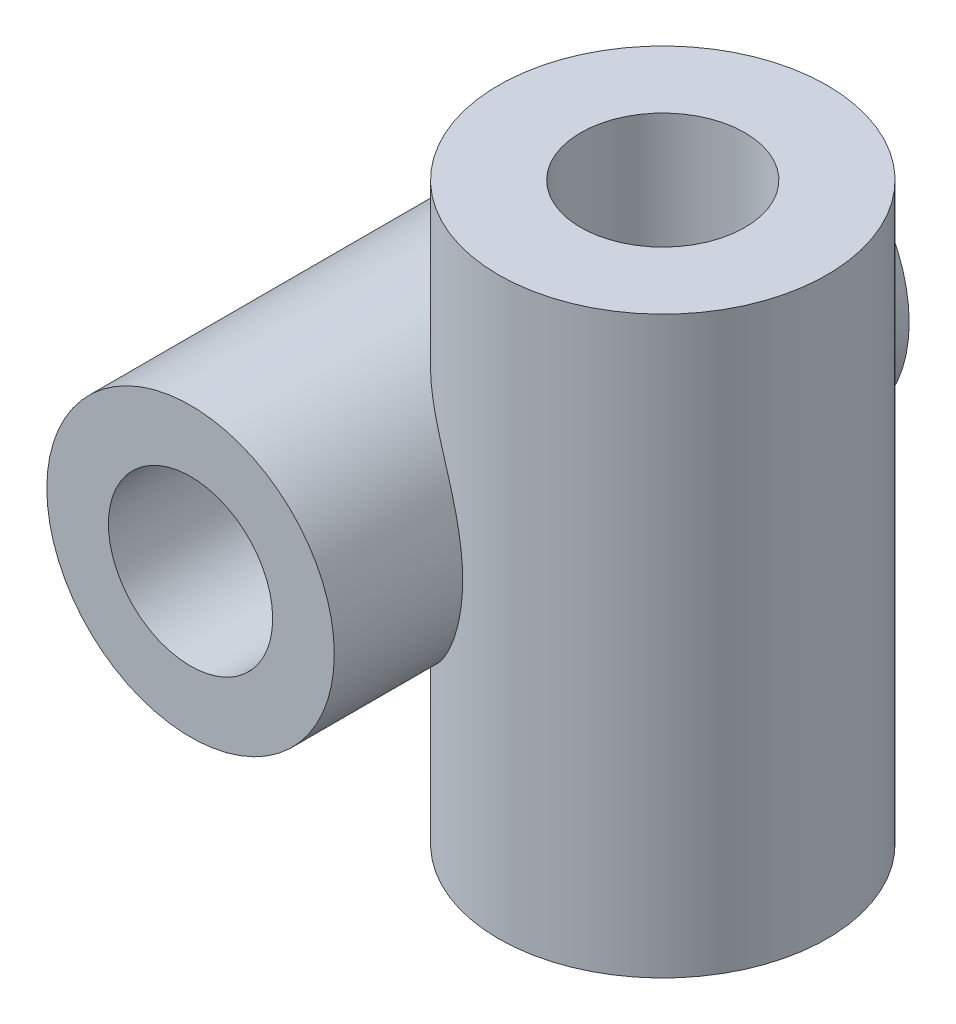
ISO-10303-21;
HEADER;
FILE_DESCRIPTION(('STEP AP214'),'2;1');
FILE_NAME('part.step','',(''),(''),'','','');
FILE_SCHEMA(('AUTOMOTIVE_DESIGN { 1 0 10303 214 1 1 1 1 }'));
ENDSEC;
DATA;
#1=APPLICATION_CONTEXT('core data for automotive mechanical design processes');
#2=APPLICATION_PROTOCOL_DEFINITION('international standard','automotive_design',2000,#1);
#3=PRODUCT_CONTEXT('',#1,'mechanical');
#4=PRODUCT('Part','Part','',(#3));
#5=PRODUCT_RELATED_PRODUCT_CATEGORY('part','',(#4));
#6=PRODUCT_DEFINITION_FORMATION('','',#4);
#7=PRODUCT_DEFINITION_CONTEXT('part definition',#1,'design');
#8=PRODUCT_DEFINITION('design','',#6,#7);
#9=PRODUCT_DEFINITION_SHAPE('','',#8);
#10=(LENGTH_UNIT() NAMED_UNIT(*) SI_UNIT(.MILLI.,.METRE.));
#11=(NAMED_UNIT(*) PLANE_ANGLE_UNIT() SI_UNIT($,.RADIAN.));
#12=(NAMED_UNIT(*) SI_UNIT($,.STERADIAN.) SOLID_ANGLE_UNIT());
#13=UNCERTAINTY_MEASURE_WITH_UNIT(LENGTH_MEASURE(1.E-05),#10,'distance_accuracy_value','');
#14=(GEOMETRIC_REPRESENTATION_CONTEXT(3) GLOBAL_UNCERTAINTY_ASSIGNED_CONTEXT((#13)) GLOBAL_UNIT_ASSIGNED_CONTEXT((#10,
#11,#12)) REPRESENTATION_CONTEXT('',''));
#15=CARTESIAN_POINT('',(0.,0.,0.));
#16=DIRECTION('',(0.,0.,1.));
#17=DIRECTION('',(1.,0.,0.));
#18=AXIS2_PLACEMENT_3D('',#15,#16,#17);
#19=CARTESIAN_POINT('',(-1.04410566392106E-13,0.,28.));
#20=DIRECTION('',(0.,0.,1.));
#21=DIRECTION('',(1.,0.,0.));
#22=AXIS2_PLACEMENT_3D('',#19,#20,#21);
#23=PLANE('',#22);
#24=CARTESIAN_POINT('',(-1.04410566392106E-13,0.,28.));
#25=DIRECTION('',(0.,0.,1.));
#26=DIRECTION('',(1.,0.,0.));
#27=AXIS2_PLACEMENT_3D('',#24,#25,#26);
#28=CIRCLE('',#27,14.);
#29=CARTESIAN_POINT('',(13.9999999999999,0.,28.));
#30=VERTEX_POINT('',#29);
#31=EDGE_CURVE('E10',#30,#30,#28,.T.);
#32=ORIENTED_EDGE('',*,*,#31,.T.);
#33=EDGE_LOOP('',(#32));
#34=FACE_BOUND('',#33,.T.);
#35=CARTESIAN_POINT('',(-1.04410566392106E-13,0.,28.));
#36=DIRECTION('',(0.,0.,1.));
#37=DIRECTION('',(1.,0.,0.));
#38=AXIS2_PLACEMENT_3D('',#35,#36,#37);
#39=CIRCLE('',#38,8.);
#40=CARTESIAN_POINT('',(7.9999999999999,0.,28.));
#41=VERTEX_POINT('',#40);
#42=EDGE_CURVE('E43',#41,#41,#39,.T.);
#43=ORIENTED_EDGE('',*,*,#42,.F.);
#44=EDGE_LOOP('',(#43));
#45=FACE_BOUND('',#44,.T.);
#46=ADVANCED_FACE('F31',(#34,#45),#23,.T.);
#47=CARTESIAN_POINT('',(-1.04410566392106E-13,0.,-28.));
#48=DIRECTION('',(0.,0.,1.));
#49=DIRECTION('',(1.,0.,0.));
#50=AXIS2_PLACEMENT_3D('',#47,#48,#49);
#51=PLANE('',#50);
#52=CARTESIAN_POINT('',(-1.04410566392106E-13,0.,-28.));
#53=DIRECTION('',(0.,0.,1.));
#54=DIRECTION('',(1.,0.,0.));
#55=AXIS2_PLACEMENT_3D('',#52,#53,#54);
#56=CIRCLE('',#55,14.);
#57=CARTESIAN_POINT('',(13.9999999999999,0.,-28.));
#58=VERTEX_POINT('',#57);
#59=EDGE_CURVE('E36',#58,#58,#56,.T.);
#60=ORIENTED_EDGE('',*,*,#59,.F.);
#61=EDGE_LOOP('',(#60));
#62=FACE_BOUND('',#61,.T.);
#63=CARTESIAN_POINT('',(-1.04410566392106E-13,0.,-28.));
#64=DIRECTION('',(0.,0.,1.));
#65=DIRECTION('',(1.,0.,0.));
#66=AXIS2_PLACEMENT_3D('',#63,#64,#65);
#67=CIRCLE('',#66,8.);
#68=CARTESIAN_POINT('',(7.9999999999999,0.,-28.));
#69=VERTEX_POINT('',#68);
#70=EDGE_CURVE('E45',#69,#69,#67,.T.);
#71=ORIENTED_EDGE('',*,*,#70,.T.);
#72=EDGE_LOOP('',(#71));
#73=FACE_BOUND('',#72,.T.);
#74=ADVANCED_FACE('F80',(#62,#73),#51,.F.);
#75=CARTESIAN_POINT('',(-1.04410566392106E-13,0.,28.));
#76=DIRECTION('',(0.,0.,-1.));
#77=DIRECTION('',(-1.,0.,0.));
#78=AXIS2_PLACEMENT_3D('',#75,#76,#77);
#79=CYLINDRICAL_SURFACE('',#78,14.);
#80=CARTESIAN_POINT('',(13.9999999999999,0.,15.4919333848297));
#81=CARTESIAN_POINT('',(14.0000010223322,0.3719893981309,15.4919319379812));
#82=CARTESIAN_POINT('',(13.9851652845214,0.743958537766238,15.4881253331868));
#83=CARTESIAN_POINT('',(13.9259351607412,1.48549698696584,15.472651530554));
#84=CARTESIAN_POINT('',(13.8815319344084,1.85506554540225,15.460981981767));
#85=CARTESIAN_POINT('',(13.7634391873865,2.5896585127759,15.4290405567903));
#86=CARTESIAN_POINT('',(13.6897082688819,2.95467574284538,15.4087565179741));
#87=CARTESIAN_POINT('',(13.5136095997293,3.6770281816098,15.3584075287863));
#88=CARTESIAN_POINT('',(13.4112440435745,4.03436397673338,15.3283433279151));
#89=CARTESIAN_POINT('',(13.1786364873007,4.73936121340051,15.2567780808745));
#90=CARTESIAN_POINT('',(13.0483474806903,5.08700521050069,15.2152577150333));
#91=CARTESIAN_POINT('',(12.7613446319282,5.76931981462684,15.1188423237718));
#92=CARTESIAN_POINT('',(12.6046301235389,6.10399009429874,15.0639469611267));
#93=CARTESIAN_POINT('',(12.2667269400419,6.75740943711765,14.9386080373643));
#94=CARTESIAN_POINT('',(12.0855560189625,7.07616982216665,14.8681757319197));
#95=CARTESIAN_POINT('',(11.7010463612786,7.69534151583395,14.709398857686));
#96=CARTESIAN_POINT('',(11.4977090511808,7.99575400328273,14.621055441243));
#97=CARTESIAN_POINT('',(11.0808218140822,8.56353855489522,14.428286468058));
#98=CARTESIAN_POINT('',(10.8680562724714,8.83176745995553,14.3246894149803));
#99=CARTESIAN_POINT('',(10.4282124858044,9.34703714807949,14.0971382459776));
#100=CARTESIAN_POINT('',(10.2011347115589,9.59407862748742,13.9731847994748));
#101=CARTESIAN_POINT('',(9.73659856178757,10.0651887025144,13.7035850204633));
#102=CARTESIAN_POINT('',(9.49914675873699,10.289271550966,13.5579522860225));
#103=CARTESIAN_POINT('',(9.01793873546161,10.7135269485602,13.2440569747968));
#104=CARTESIAN_POINT('',(8.77418293542418,10.9137010863456,13.0757959031601));
#105=CARTESIAN_POINT('',(8.30509106729305,11.2741118813541,12.7313108204222));
#106=CARTESIAN_POINT('',(8.07990295716784,11.4362836045115,12.5569029111898));
#107=CARTESIAN_POINT('',(7.63135125797163,11.7403531444371,12.1891431261527));
#108=CARTESIAN_POINT('',(7.40798755672186,11.8822522167085,11.9957924247432));
#109=CARTESIAN_POINT('',(6.96626871744345,12.1464963270059,11.5907971614857));
#110=CARTESIAN_POINT('',(6.7479145896599,12.268837450096,11.3791489500366));
#111=CARTESIAN_POINT('',(6.31919476081952,12.4950607332025,10.938613627307));
#112=CARTESIAN_POINT('',(6.1088293939007,12.5989421217889,10.7097257961538));
#113=CARTESIAN_POINT('',(5.69477093902298,12.7915095924464,10.2314842600988));
#114=CARTESIAN_POINT('',(5.49128033511558,12.8798697642549,9.98182451767351));
#115=CARTESIAN_POINT('',(5.09756354532838,13.0407086490837,9.46742083189415));
#116=CARTESIAN_POINT('',(4.90733740691156,13.1131873052785,9.2026768345717));
#117=CARTESIAN_POINT('',(4.54195041100528,13.2441828167058,8.65956498000809));
#118=CARTESIAN_POINT('',(4.36679492854313,13.3026947037104,8.38119231711594));
#119=CARTESIAN_POINT('',(4.0331087629745,13.407633223415,7.81246952220624));
#120=CARTESIAN_POINT('',(3.8745791596488,13.4540590714675,7.52211861395635));
#121=CARTESIAN_POINT('',(3.55457786400708,13.5423869176069,6.88999548082267));
#122=CARTESIAN_POINT('',(3.39574339650246,13.5827702194482,6.54667364342047));
#123=CARTESIAN_POINT('',(3.10248068202797,13.6527412284995,5.84869716529793));
#124=CARTESIAN_POINT('',(2.96805424481148,13.6823281353662,5.49404168652635));
#125=CARTESIAN_POINT('',(2.72453722881706,13.7328939580388,4.77537837736546));
#126=CARTESIAN_POINT('',(2.61545736400202,13.7538692365831,4.41136666405002));
#127=CARTESIAN_POINT('',(2.42341677314304,13.7890018452293,3.67619695590906));
#128=CARTESIAN_POINT('',(2.34045719874774,13.8031588747277,3.30503864675414));
#129=CARTESIAN_POINT('',(2.19237137366985,13.8275044610656,2.51040764440345));
#130=CARTESIAN_POINT('',(2.13081589920177,13.8369669278539,2.08624299719925));
#131=CARTESIAN_POINT('',(2.04192538833772,13.8503628485877,1.23423932546827));
#132=CARTESIAN_POINT('',(2.01459305607975,13.8542958656274,0.806400013277153));
#133=CARTESIAN_POINT('',(1.99434217028345,13.8572258961627,-0.0502421860832204));
#134=CARTESIAN_POINT('',(2.00143400896337,13.8562214190908,-0.479045325165186));
#135=CARTESIAN_POINT('',(2.05000595660913,13.8491180338994,-1.33465578765831));
#136=CARTESIAN_POINT('',(2.09148621039783,13.8430191043253,-1.76146310265668));
#137=CARTESIAN_POINT('',(2.21073321043063,13.824487363549,-2.62612862836137));
#138=CARTESIAN_POINT('',(2.28979810974131,13.8118263627565,-3.06380373303443));
#139=CARTESIAN_POINT('',(2.48399867564151,13.7782237323857,-3.93078223037483));
#140=CARTESIAN_POINT('',(2.59913596085037,13.757281731216,-4.36008524645623));
#141=CARTESIAN_POINT('',(2.86454074947749,13.7044778045725,-5.20720067808821));
#142=CARTESIAN_POINT('',(3.01482128003288,13.6726118276792,-5.62500876827648));
#143=CARTESIAN_POINT('',(3.34903795154691,13.5946083402935,-6.44558195288962));
#144=CARTESIAN_POINT('',(3.5329727179728,13.5484714126133,-6.84834766087862));
#145=CARTESIAN_POINT('',(3.92765925962188,13.439285003986,-7.62592554742595));
#146=CARTESIAN_POINT('',(4.13766550852467,13.3766658369723,-8.00117563769634));
#147=CARTESIAN_POINT('',(4.58510671433127,13.2299732735159,-8.73061580235941));
#148=CARTESIAN_POINT('',(4.82254184791418,13.1458997388738,-9.08480574107398));
#149=CARTESIAN_POINT('',(5.32079408466342,12.952236908248,-9.76812304514505));
#150=CARTESIAN_POINT('',(5.58157414114876,12.8426876139583,-10.0972886391936));
#151=CARTESIAN_POINT('',(6.12200605958196,12.5940222859687,-10.7277920326739));
#152=CARTESIAN_POINT('',(6.40165379744517,12.4549126993394,-11.0291358794769));
#153=CARTESIAN_POINT('',(6.93650706071177,12.1640893868423,-11.563867119753));
#154=CARTESIAN_POINT('',(7.19015463672293,12.0163746344405,-11.8009941100826));
#155=CARTESIAN_POINT('',(7.70250774587176,11.6945639210744,-12.2506232724897));
#156=CARTESIAN_POINT('',(7.96121280746002,11.5204704094892,-12.4631277276439));
#157=CARTESIAN_POINT('',(8.47846199534632,11.1452987684384,-12.8626235576442));
#158=CARTESIAN_POINT('',(8.73700613174953,10.9442355662721,-13.0496289311877));
#159=CARTESIAN_POINT('',(9.2488464585048,10.5152403507644,-13.3982536522082));
#160=CARTESIAN_POINT('',(9.50214308510588,10.2873105815858,-13.5598751173748));
#161=CARTESIAN_POINT('',(9.96601038048726,9.83712775699864,-13.8390200923727));
#162=CARTESIAN_POINT('',(10.1778413221085,9.61801963903996,-13.9595460744803));
#163=CARTESIAN_POINT('',(10.5906821332115,9.1614487637564,-14.1829861902651));
#164=CARTESIAN_POINT('',(10.7916931540159,8.92398796587345,-14.2859022003279));
#165=CARTESIAN_POINT('',(11.1802601810072,8.4320849382857,-14.475424382061));
#166=CARTESIAN_POINT('',(11.3678132665817,8.17763904549972,-14.5620270200255));
#167=CARTESIAN_POINT('',(11.7271381961147,7.65344483833426,-14.7203861704857));
#168=CARTESIAN_POINT('',(11.898909218597,7.38369572858383,-14.7921419104249));
#169=CARTESIAN_POINT('',(12.228254807454,6.82475257956943,-14.9237760579557));
#170=CARTESIAN_POINT('',(12.3854472201623,6.53526606857633,-14.9833676477364));
#171=CARTESIAN_POINT('',(12.6797667253518,5.9441189269146,-15.0903825997153));
#172=CARTESIAN_POINT('',(12.8168937888481,5.64245827866096,-15.1378059443363));
#173=CARTESIAN_POINT('',(13.069850171734,5.02883438560741,-15.22206975182));
#174=CARTESIAN_POINT('',(13.1856747834149,4.71686888142395,-15.2589078764242));
#175=CARTESIAN_POINT('',(13.3950296681057,4.08461683763342,-15.3233888223324));
#176=CARTESIAN_POINT('',(13.4885588455723,3.76432988998815,-15.3510311918057));
#177=CARTESIAN_POINT('',(13.6596577931562,3.08951236016707,-15.4003263345912));
#178=CARTESIAN_POINT('',(13.735164792468,2.7344047055071,-15.4212600558785));
#179=CARTESIAN_POINT('',(13.8584042229182,2.01900975098615,-15.4548134979711));
#180=CARTESIAN_POINT('',(13.9061352323254,1.65872218695536,-15.4674327932017));
#181=CARTESIAN_POINT('',(13.9734515509374,0.935240188415863,-15.4850935867121));
#182=CARTESIAN_POINT('',(13.9930289275377,0.572044963615724,-15.4901329492786));
#183=CARTESIAN_POINT('',(14.0038620300949,-0.154795989163676,-15.4929309027017));
#184=CARTESIAN_POINT('',(13.9951173361474,-0.518441723742316,-15.4906893856117));
#185=CARTESIAN_POINT('',(13.9483594605568,-1.25986103096941,-15.4785281757133));
#186=CARTESIAN_POINT('',(13.9090710406459,-1.63754947080463,-15.4682738396915));
#187=CARTESIAN_POINT('',(13.8000168950498,-2.38817354155169,-15.4390194281233));
#188=CARTESIAN_POINT('',(13.7302500103201,-2.76110899116023,-15.4200190199771));
#189=CARTESIAN_POINT('',(13.5608466758028,-3.49956522916187,-15.3721066467605));
#190=CARTESIAN_POINT('',(13.4612048941198,-3.8650846815482,-15.3431929122857));
#191=CARTESIAN_POINT('',(13.2330147353205,-4.58587019798531,-15.2738358739624));
#192=CARTESIAN_POINT('',(13.1044669750903,-4.94113648066776,-15.2333928161578));
#193=CARTESIAN_POINT('',(12.8210489946112,-5.63561313287337,-15.1393708621623));
#194=CARTESIAN_POINT('',(12.6664145796669,-5.97493528152639,-15.0859078888758));
#195=CARTESIAN_POINT('',(12.3318709845809,-6.63798344683747,-14.9634228770433));
#196=CARTESIAN_POINT('',(12.1519617272526,-6.9617094158624,-14.8944007909811));
#197=CARTESIAN_POINT('',(11.7693866538876,-7.59057877943662,-14.7384555534411));
#198=CARTESIAN_POINT('',(11.5667375747351,-7.89573558934801,-14.6515455289851));
#199=CARTESIAN_POINT('',(11.1416155263069,-8.48506718238525,-14.4574242699417));
#200=CARTESIAN_POINT('',(10.9191443759557,-8.76924388633266,-14.3502148970611));
#201=CARTESIAN_POINT('',(10.4741444971619,-9.2953015340768,-14.1216013070429));
#202=CARTESIAN_POINT('',(10.252694140213,-9.53874936868367,-14.0017012716596));
#203=CARTESIAN_POINT('',(9.7993915277861,-10.0038671492477,-13.7411181322249));
#204=CARTESIAN_POINT('',(9.56753984372,-10.2255382894099,-13.6004361688873));
#205=CARTESIAN_POINT('',(9.09746058203268,-10.6459197121628,-13.297478058772));
#206=CARTESIAN_POINT('',(8.85923601239756,-10.8446405996745,-13.1352119608457));
#207=CARTESIAN_POINT('',(8.38045367358236,-11.2187476157424,-12.7887298100641));
#208=CARTESIAN_POINT('',(8.13989599056826,-11.3941346025662,-12.6045145650152));
#209=CARTESIAN_POINT('',(7.67780420750712,-11.7099946142202,-12.2284325388142));
#210=CARTESIAN_POINT('',(7.45614296407507,-11.8520694302155,-12.0380617706204));
#211=CARTESIAN_POINT('',(7.01756245336114,-12.1169074251783,-11.6393249421734));
#212=CARTESIAN_POINT('',(6.80064292372984,-12.2396716749007,-11.4309598806819));
#213=CARTESIAN_POINT('',(6.37437257996178,-12.4669866684238,-10.9971493297208));
#214=CARTESIAN_POINT('',(6.16502385236452,-12.5715324210061,-10.771699183745));
#215=CARTESIAN_POINT('',(5.75648521731966,-12.7637714356506,-10.3049768948195));
#216=CARTESIAN_POINT('',(5.557295858607,-12.8514637881218,-10.0637038988406));
#217=CARTESIAN_POINT('',(5.16113675281877,-13.0157997570397,-9.55370215806306));
#218=CARTESIAN_POINT('',(4.9648277352158,-13.0916258332646,-9.28419744817913));
#219=CARTESIAN_POINT('',(4.58790488952025,-13.2284292466052,-8.73085315909167));
#220=CARTESIAN_POINT('',(4.40729143554609,-13.2894062298415,-8.44701323844985));
#221=CARTESIAN_POINT('',(4.06332149864369,-13.3985820145389,-7.86656539416624));
#222=CARTESIAN_POINT('',(3.89997187973651,-13.4467757448497,-7.56995245750926));
#223=CARTESIAN_POINT('',(3.59188019224728,-13.5323301063804,-6.96571064116608));
#224=CARTESIAN_POINT('',(3.44713929678048,-13.5696900548125,-6.65808106854004));
#225=CARTESIAN_POINT('',(3.1571400169486,-13.6403068722276,-5.9868454904395));
#226=CARTESIAN_POINT('',(3.01501851429771,-13.6721227414502,-5.62172917900673));
#227=CARTESIAN_POINT('',(2.75777785237119,-13.726322873475,-4.88142084924792));
#228=CARTESIAN_POINT('',(2.64266088706079,-13.748706370068,-4.50622801501959));
#229=CARTESIAN_POINT('',(2.44020610887152,-13.7860800501147,-3.7479156010252));
#230=CARTESIAN_POINT('',(2.35287856594805,-13.8010675013844,-3.36479314634066));
#231=CARTESIAN_POINT('',(2.20662418311687,-13.8252050427123,-2.59298602174278));
#232=CARTESIAN_POINT('',(2.14769832996876,-13.8343549299595,-2.20430115905779));
#233=CARTESIAN_POINT('',(2.05385715820689,-13.8486175317774,-1.38187764664942));
#234=CARTESIAN_POINT('',(2.02217503515958,-13.8531952429008,-0.947757314009264));
#235=CARTESIAN_POINT('',(1.9942802470715,-13.8572375752184,-0.0783359031601875));
#236=CARTESIAN_POINT('',(1.99807014905972,-13.8567018263632,0.356965258223676));
#237=CARTESIAN_POINT('',(2.04110380458551,-13.8504285514721,1.22594296822046));
#238=CARTESIAN_POINT('',(2.08036083796351,-13.8446890770197,1.65961884720498));
#239=CARTESIAN_POINT('',(2.19406100420439,-13.8271254264709,2.5222097661283));
#240=CARTESIAN_POINT('',(2.2685040611454,-13.8153012635035,2.95112481633762));
#241=CARTESIAN_POINT('',(2.45403696554343,-13.7835684725784,3.81057993117113));
#242=CARTESIAN_POINT('',(2.565898038334,-13.7634874766331,4.24094762032226));
#243=CARTESIAN_POINT('',(2.82483972014217,-13.712683042927,5.09034730744066));
#244=CARTESIAN_POINT('',(2.97192169500787,-13.6819591924213,5.50937886509714));
#245=CARTESIAN_POINT('',(3.29991297239227,-13.6065748448491,6.33275717344604));
#246=CARTESIAN_POINT('',(3.48082451036022,-13.5619134266611,6.73710295159588));
#247=CARTESIAN_POINT('',(3.87446460808367,-13.4547429542298,7.52755752530308));
#248=CARTESIAN_POINT('',(4.08719093946973,-13.3922351497033,7.91366759563433));
#249=CARTESIAN_POINT('',(4.53178458629659,-13.2482110164413,8.64772912953551));
#250=CARTESIAN_POINT('',(4.76242081865325,-13.1676371879503,8.99660937579917));
#251=CARTESIAN_POINT('',(5.24688630540064,-12.9821959073676,9.67111367310789));
#252=CARTESIAN_POINT('',(5.50071516591912,-12.8773288677927,9.99673811893077));
#253=CARTESIAN_POINT('',(6.02669021045121,-12.6397032026824,10.6210239546251));
#254=CARTESIAN_POINT('',(6.29880424298495,-12.5069927059651,10.9197306158785));
#255=CARTESIAN_POINT('',(6.85616340885904,-12.2103458671319,11.4879577311215));
#256=CARTESIAN_POINT('',(7.14140554323645,-12.0464166299909,11.7574848041522));
#257=CARTESIAN_POINT('',(7.67543480204572,-11.7120303126262,12.2274474051982));
#258=CARTESIAN_POINT('',(7.92332539272071,-11.546180332966,12.4321948027418));
#259=CARTESIAN_POINT('',(8.41937860798611,-11.1896070068989,12.8183638843327));
#260=CARTESIAN_POINT('',(8.66754120092175,-10.9988863015299,12.9997880410331));
#261=CARTESIAN_POINT('',(9.15948786884705,-10.5927100857364,13.3392158800285));
#262=CARTESIAN_POINT('',(9.40327280794802,-10.3772595202439,13.4972242300731));
#263=CARTESIAN_POINT('',(9.88202881286162,-9.92242376312254,13.790481025752));
#264=CARTESIAN_POINT('',(10.1170002042083,-9.6830394567012,13.9257303126514));
#265=CARTESIAN_POINT('',(10.5508111256428,-9.20724228858997,14.1620726623845));
#266=CARTESIAN_POINT('',(10.7508987782066,-8.97298820294156,14.2652383525544));
#267=CARTESIAN_POINT('',(11.1379757187451,-8.48774412016533,14.4554186218102));
#268=CARTESIAN_POINT('',(11.3249660761581,-8.23675549274342,14.5424345205404));
#269=CARTESIAN_POINT('',(11.6836807519858,-7.71950256393237,14.7017912820205));
#270=CARTESIAN_POINT('',(11.8553979240501,-7.45323120660028,14.7741252951727));
#271=CARTESIAN_POINT('',(12.1816010643344,-6.90722420517958,14.9056086457293));
#272=CARTESIAN_POINT('',(12.3360862985684,-6.62748798828783,14.964757421622));
#273=CARTESIAN_POINT('',(12.6335680250358,-6.04202736409648,15.0740763748559));
#274=CARTESIAN_POINT('',(12.7756031064182,-5.73570294409802,15.1236493297829));
#275=CARTESIAN_POINT('',(13.0376286744537,-5.11220307648093,15.2116395802049));
#276=CARTESIAN_POINT('',(13.1576172201316,-4.79502667636805,15.2500558936429));
#277=CARTESIAN_POINT('',(13.3743970370869,-4.15216391905494,15.3172018499767));
#278=CARTESIAN_POINT('',(13.471208669746,-3.82648531229574,15.3459400044248));
#279=CARTESIAN_POINT('',(13.6409815207266,-3.16845164723531,15.3950234938114));
#280=CARTESIAN_POINT('',(13.7139480243468,-2.83609808580421,15.4153706888775));
#281=CARTESIAN_POINT('',(13.8495534188615,-2.08929813976195,15.4525048346954));
#282=CARTESIAN_POINT('',(13.9059247627535,-1.67360406718945,15.4673870649412));
#283=CARTESIAN_POINT('',(13.9811482258688,-0.838598179703821,15.4871023559461));
#284=CARTESIAN_POINT('',(13.9999988476826,-0.419286221075626,15.4919350156386));
#285=CARTESIAN_POINT('',(13.9999999999999,0.,15.4919333848297));
#286=B_SPLINE_CURVE_WITH_KNOTS('',3,(#80,#81,#82,#83,#84,#85,#86,#87,#88,#89,#90,#91,#92,#93,
#94,#95,#96,#97,#98,#99,#100,#101,#102,#103,#104,#105,#106,#107,#108,#109,#110,#111,#112,#113,
#114,#115,#116,#117,#118,#119,#120,#121,#122,#123,#124,#125,#126,#127,#128,#129,#130,#131,#132,
#133,#134,#135,#136,#137,#138,#139,#140,#141,#142,#143,#144,#145,#146,#147,#148,#149,#150,#151,
#152,#153,#154,#155,#156,#157,#158,#159,#160,#161,#162,#163,#164,#165,#166,#167,#168,#169,#170,
#171,#172,#173,#174,#175,#176,#177,#178,#179,#180,#181,#182,#183,#184,#185,#186,#187,#188,#189,
#190,#191,#192,#193,#194,#195,#196,#197,#198,#199,#200,#201,#202,#203,#204,#205,#206,#207,#208,
#209,#210,#211,#212,#213,#214,#215,#216,#217,#218,#219,#220,#221,#222,#223,#224,#225,#226,#227,
#228,#229,#230,#231,#232,#233,#234,#235,#236,#237,#238,#239,#240,#241,#242,#243,#244,#245,#246,
#247,#248,#249,#250,#251,#252,#253,#254,#255,#256,#257,#258,#259,#260,#261,#262,#263,#264,#265,
#266,#267,#268,#269,#270,#271,#272,#273,#274,#275,#276,#277,#278,#279,#280,#281,#282,#283,#284,
#285),.UNSPECIFIED.,.T.,.F.,(4,2,2,2,2,2,2,2,2,2,2,2,2,2,2,2,2,2,2,2,2,2,2,2,2,2,2,2,2,2,2,2,2,
2,2,2,2,2,2,2,2,2,2,2,2,2,2,2,2,2,2,2,2,2,2,2,2,2,2,2,2,2,2,2,2,2,2,2,2,2,2,2,2,2,2,2,2,2,2,2,2,
2,2,2,2,2,2,2,2,2,2,2,2,2,2,2,2,2,2,2,2,2,4),(0.,1.1156177769199,2.23156926150023,
3.3491016013208,4.46654831947236,5.5858911400937,6.70526218572042,7.82382495540331,
8.9423157830015,10.013962544214,11.0855740712598,12.1565162533687,13.2273872358127,
14.2094945078149,15.1915409306536,16.1737836853168,17.1560674781307,18.1569991782141,
19.1579344596528,20.1592252627184,21.1605810551831,22.3007162371138,23.4409359208108,
24.5816367006641,25.7223877671948,27.0070710201967,28.2918557759068,29.5770284158699,
30.8622064682175,32.195413743443,33.5286808501475,34.862442966984,36.1961506214143,
37.4980001015192,38.7998579677621,40.0996853142503,41.3992294601077,42.5295803236096,
43.6598262935125,44.7894492516769,45.9189779192759,46.9010181631258,47.8829537029396,
48.8651016998263,49.8473007898215,50.8505045918503,51.8537098430142,52.8571365305713,
53.8606125139069,54.9503410813101,56.0401254222402,57.1302167621129,58.2203242638098,
59.3585630678554,60.4968451609639,61.6353305289921,62.7737916027625,63.9024649135038,
65.0311416711692,66.1589930864862,67.2867411136307,68.336118714633,69.3854387369991,
70.4342719298398,71.4830665338218,72.4566512514841,73.4301819656336,74.4039789745955,
75.3778285253842,76.4026020908613,77.4274000760769,78.4526039954034,79.4778725131013,
80.6559203527328,81.8340638689357,83.0126422796551,84.1912616347609,85.4956527922389,
86.8001383462393,88.1051125369576,89.4100839119094,90.7438047961186,92.0775774097018,
93.4114381898172,94.7452055874695,96.0210987745252,97.296970297562,98.5706543191762,
99.8440488127255,100.927821172623,102.011478539628,103.094919596979,104.178320597254,
105.151894676471,106.12538916719,107.099336787462,108.073325876725,109.096041919891,
110.118847959795,111.140752119374,112.162429618911,113.419843129672,114.677306821379),.UNSPECIFIED.);
#287=CARTESIAN_POINT('',(13.9999999999999,0.,15.4919333848297));
#288=VERTEX_POINT('',#287);
#289=EDGE_CURVE('E48',#288,#288,#286,.T.);
#290=ORIENTED_EDGE('',*,*,#289,.T.);
#291=EDGE_LOOP('',(#290));
#292=FACE_BOUND('',#291,.T.);
#293=ORIENTED_EDGE('',*,*,#31,.F.);
#294=EDGE_LOOP('',(#293));
#295=FACE_BOUND('',#294,.T.);
#296=ORIENTED_EDGE('',*,*,#59,.T.);
#297=EDGE_LOOP('',(#296));
#298=FACE_BOUND('',#297,.T.);
#299=ADVANCED_FACE('F33',(#292,#295,#298),#79,.T.);
#300=CARTESIAN_POINT('',(-1.04410566392106E-13,0.,28.));
#301=DIRECTION('',(0.,0.,-1.));
#302=DIRECTION('',(-1.,0.,0.));
#303=AXIS2_PLACEMENT_3D('',#300,#301,#302);
#304=CYLINDRICAL_SURFACE('',#303,8.);
#305=ORIENTED_EDGE('',*,*,#42,.T.);
#306=EDGE_LOOP('',(#305));
#307=FACE_BOUND('',#306,.T.);
#308=ORIENTED_EDGE('',*,*,#70,.F.);
#309=EDGE_LOOP('',(#308));
#310=FACE_BOUND('',#309,.T.);
#311=ADVANCED_FACE('F71',(#307,#310),#304,.F.);
#312=CARTESIAN_POINT('',(18.,-19.9682840347334,0.));
#313=DIRECTION('',(0.,-1.,0.));
#314=DIRECTION('',(0.,0.,-1.));
#315=AXIS2_PLACEMENT_3D('',#312,#313,#314);
#316=CYLINDRICAL_SURFACE('',#315,8.);
#317=CARTESIAN_POINT('',(18.,-28.,0.));
#318=DIRECTION('',(0.,-1.,0.));
#319=DIRECTION('',(0.,0.,-1.));
#320=AXIS2_PLACEMENT_3D('',#317,#318,#319);
#321=CIRCLE('',#320,8.00000000000001);
#322=CARTESIAN_POINT('',(18.,-28.,-8.00000000000001));
#323=VERTEX_POINT('',#322);
#324=EDGE_CURVE('E159',#323,#323,#321,.T.);
#325=ORIENTED_EDGE('',*,*,#324,.T.);
#326=EDGE_LOOP('',(#325));
#327=FACE_BOUND('',#326,.T.);
#328=CARTESIAN_POINT('',(18.,28.,0.));
#329=DIRECTION('',(0.,-1.,0.));
#330=DIRECTION('',(0.,0.,-1.));
#331=AXIS2_PLACEMENT_3D('',#328,#329,#330);
#332=CIRCLE('',#331,8.);
#333=CARTESIAN_POINT('',(18.,28.,-8.));
#334=VERTEX_POINT('',#333);
#335=EDGE_CURVE('E56',#334,#334,#332,.T.);
#336=ORIENTED_EDGE('',*,*,#335,.F.);
#337=EDGE_LOOP('',(#336));
#338=FACE_BOUND('',#337,.T.);
#339=ADVANCED_FACE('F63',(#327,#338),#316,.F.);
#340=CARTESIAN_POINT('',(18.,-19.9682840347334,0.));
#341=DIRECTION('',(0.,-1.,0.));
#342=DIRECTION('',(0.,0.,-1.));
#343=AXIS2_PLACEMENT_3D('',#340,#341,#342);
#344=CYLINDRICAL_SURFACE('',#343,16.);
#345=CARTESIAN_POINT('',(18.,-28.,0.));
#346=DIRECTION('',(0.,-1.,0.));
#347=DIRECTION('',(0.,0.,-1.));
#348=AXIS2_PLACEMENT_3D('',#345,#346,#347);
#349=CIRCLE('',#348,16.);
#350=CARTESIAN_POINT('',(18.,-28.,-16.));
#351=VERTEX_POINT('',#350);
#352=EDGE_CURVE('E156',#351,#351,#349,.T.);
#353=ORIENTED_EDGE('',*,*,#352,.F.);
#354=EDGE_LOOP('',(#353));
#355=FACE_BOUND('',#354,.T.);
#356=CARTESIAN_POINT('',(18.,28.,0.));
#357=DIRECTION('',(0.,-1.,0.));
#358=DIRECTION('',(0.,0.,-1.));
#359=AXIS2_PLACEMENT_3D('',#356,#357,#358);
#360=CIRCLE('',#359,16.);
#361=CARTESIAN_POINT('',(18.,28.,-16.));
#362=VERTEX_POINT('',#361);
#363=EDGE_CURVE('E154',#362,#362,#360,.T.);
#364=ORIENTED_EDGE('',*,*,#363,.T.);
#365=EDGE_LOOP('',(#364));
#366=FACE_BOUND('',#365,.T.);
#367=ORIENTED_EDGE('',*,*,#289,.F.);
#368=EDGE_LOOP('',(#367));
#369=FACE_BOUND('',#368,.T.);
#370=ADVANCED_FACE('F58',(#355,#366,#369),#344,.T.);
#371=CARTESIAN_POINT('',(34.,28.,0.));
#372=DIRECTION('',(0.,1.,0.));
#373=DIRECTION('',(0.,0.,1.));
#374=AXIS2_PLACEMENT_3D('',#371,#372,#373);
#375=PLANE('',#374);
#376=ORIENTED_EDGE('',*,*,#335,.T.);
#377=EDGE_LOOP('',(#376));
#378=FACE_BOUND('',#377,.T.);
#379=ORIENTED_EDGE('',*,*,#363,.F.);
#380=EDGE_LOOP('',(#379));
#381=FACE_BOUND('',#380,.T.);
#382=ADVANCED_FACE('F62',(#378,#381),#375,.T.);
#383=CARTESIAN_POINT('',(26.,-28.,0.));
#384=DIRECTION('',(0.,-1.,0.));
#385=DIRECTION('',(0.,0.,-1.));
#386=AXIS2_PLACEMENT_3D('',#383,#384,#385);
#387=PLANE('',#386);
#388=ORIENTED_EDGE('',*,*,#352,.T.);
#389=EDGE_LOOP('',(#388));
#390=FACE_BOUND('',#389,.T.);
#391=ORIENTED_EDGE('',*,*,#324,.F.);
#392=EDGE_LOOP('',(#391));
#393=FACE_BOUND('',#392,.T.);
#394=ADVANCED_FACE('F65',(#390,#393),#387,.T.);
#395=CLOSED_SHELL('',(#46,#74,#299,#311,#339,#370,#382,#394));
#396=MANIFOLD_SOLID_BREP('B2',#395);
#397=ADVANCED_BREP_SHAPE_REPRESENTATION('',(#18,#396),#14);
#398=SHAPE_DEFINITION_REPRESENTATION(#9,#397);
ENDSEC;
END-ISO-10303-21;
